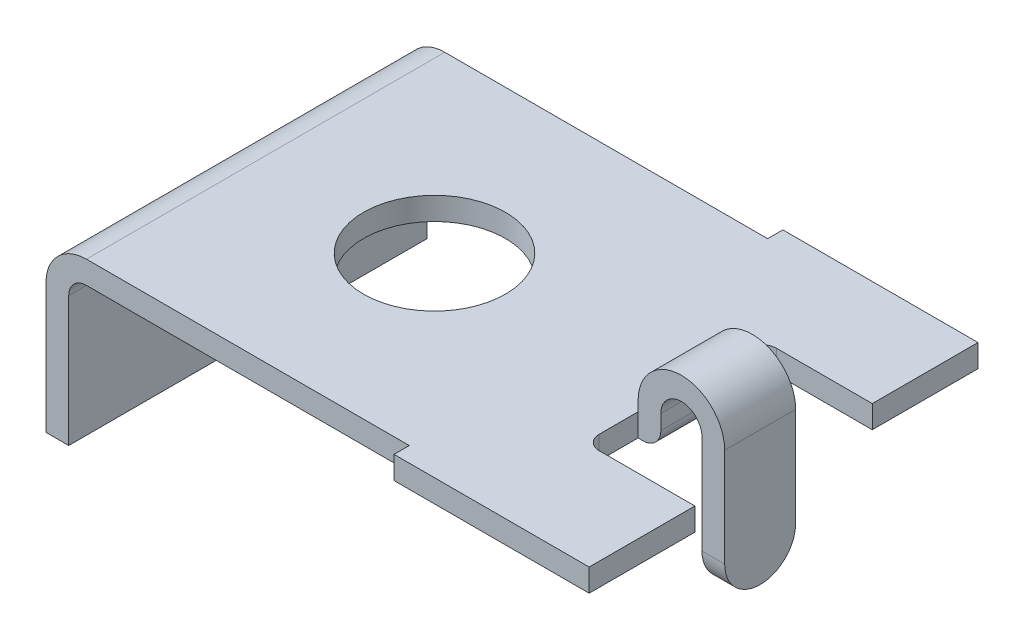
ISO-10303-21;
HEADER;
FILE_DESCRIPTION(('STEP AP214'),'2;1');
FILE_NAME('part.step','',(''),(''),'','','');
FILE_SCHEMA(('AUTOMOTIVE_DESIGN { 1 0 10303 214 1 1 1 1 }'));
ENDSEC;
DATA;
#1=APPLICATION_CONTEXT('core data for automotive mechanical design processes');
#2=APPLICATION_PROTOCOL_DEFINITION('international standard','automotive_design',2000,#1);
#3=PRODUCT_CONTEXT('',#1,'mechanical');
#4=PRODUCT('Part','Part','',(#3));
#5=PRODUCT_RELATED_PRODUCT_CATEGORY('part','',(#4));
#6=PRODUCT_DEFINITION_FORMATION('','',#4);
#7=PRODUCT_DEFINITION_CONTEXT('part definition',#1,'design');
#8=PRODUCT_DEFINITION('design','',#6,#7);
#9=PRODUCT_DEFINITION_SHAPE('','',#8);
#10=(LENGTH_UNIT() NAMED_UNIT(*) SI_UNIT(.MILLI.,.METRE.));
#11=(NAMED_UNIT(*) PLANE_ANGLE_UNIT() SI_UNIT($,.RADIAN.));
#12=(NAMED_UNIT(*) SI_UNIT($,.STERADIAN.) SOLID_ANGLE_UNIT());
#13=UNCERTAINTY_MEASURE_WITH_UNIT(LENGTH_MEASURE(1.E-05),#10,'distance_accuracy_value','');
#14=(GEOMETRIC_REPRESENTATION_CONTEXT(3) GLOBAL_UNCERTAINTY_ASSIGNED_CONTEXT((#13)) GLOBAL_UNIT_ASSIGNED_CONTEXT((#10,
#11,#12)) REPRESENTATION_CONTEXT('',''));
#15=CARTESIAN_POINT('',(0.,0.,0.));
#16=DIRECTION('',(0.,0.,1.));
#17=DIRECTION('',(1.,0.,0.));
#18=AXIS2_PLACEMENT_3D('',#15,#16,#17);
#19=CARTESIAN_POINT('',(18.3388,2.921,0.));
#20=DIRECTION('',(-1.,0.,0.));
#21=DIRECTION('',(0.,0.,1.));
#22=AXIS2_PLACEMENT_3D('',#19,#20,#21);
#23=CYLINDRICAL_SURFACE('',#22,1.27);
#24=DIRECTION('',(1.,0.,0.));
#25=VECTOR('',#24,1.);
#26=CARTESIAN_POINT('',(18.3388,2.921,1.27));
#27=LINE('',#26,#25);
#28=CARTESIAN_POINT('',(18.3388,2.921,1.27));
#29=VERTEX_POINT('',#28);
#30=CARTESIAN_POINT('',(19.1516,2.921,1.27));
#31=VERTEX_POINT('',#30);
#32=EDGE_CURVE('E252',#29,#31,#27,.T.);
#33=ORIENTED_EDGE('',*,*,#32,.F.);
#34=CARTESIAN_POINT('',(18.3388,2.921,0.));
#35=DIRECTION('',(1.,0.,0.));
#36=DIRECTION('',(0.,0.,-1.));
#37=AXIS2_PLACEMENT_3D('',#34,#35,#36);
#38=CIRCLE('',#37,1.27);
#39=CARTESIAN_POINT('',(18.3388,2.921,-1.27));
#40=VERTEX_POINT('',#39);
#41=EDGE_CURVE('E476',#40,#29,#38,.F.);
#42=ORIENTED_EDGE('',*,*,#41,.F.);
#43=DIRECTION('',(-1.,0.,0.));
#44=VECTOR('',#43,1.);
#45=CARTESIAN_POINT('',(17.6022,2.921,-1.27));
#46=LINE('',#45,#44);
#47=CARTESIAN_POINT('',(19.1516,2.921,-1.27));
#48=VERTEX_POINT('',#47);
#49=EDGE_CURVE('E472',#48,#40,#46,.T.);
#50=ORIENTED_EDGE('',*,*,#49,.F.);
#51=CARTESIAN_POINT('',(19.1516,2.921,0.));
#52=DIRECTION('',(1.,0.,0.));
#53=DIRECTION('',(0.,0.,-1.));
#54=AXIS2_PLACEMENT_3D('',#51,#52,#53);
#55=CIRCLE('',#54,1.27);
#56=EDGE_CURVE('E479',#31,#48,#55,.T.);
#57=ORIENTED_EDGE('',*,*,#56,.F.);
#58=EDGE_LOOP('',(#33,#42,#50,#57));
#59=FACE_BOUND('',#58,.T.);
#60=ADVANCED_FACE('F44',(#59),#23,.T.);
#61=CARTESIAN_POINT('',(16.0528,0.,3.175));
#62=DIRECTION('',(-1.,0.,0.));
#63=DIRECTION('',(0.,0.,1.));
#64=AXIS2_PLACEMENT_3D('',#61,#62,#63);
#65=PLANE('',#64);
#66=DIRECTION('',(0.,0.,1.));
#67=VECTOR('',#66,1.);
#68=CARTESIAN_POINT('',(16.0528,6.096,3.175));
#69=LINE('',#68,#67);
#70=CARTESIAN_POINT('',(16.0528,6.096,1.27));
#71=VERTEX_POINT('',#70);
#72=CARTESIAN_POINT('',(16.0528,6.096,2.667));
#73=VERTEX_POINT('',#72);
#74=EDGE_CURVE('E316',#71,#73,#69,.T.);
#75=ORIENTED_EDGE('',*,*,#74,.T.);
#76=DIRECTION('',(0.,1.,0.));
#77=VECTOR('',#76,1.);
#78=CARTESIAN_POINT('',(16.0528,5.2832,2.667));
#79=LINE('',#78,#77);
#80=CARTESIAN_POINT('',(16.0528,5.2832,2.667));
#81=VERTEX_POINT('',#80);
#82=EDGE_CURVE('E499',#73,#81,#79,.F.);
#83=ORIENTED_EDGE('',*,*,#82,.T.);
#84=DIRECTION('',(0.,0.,1.));
#85=VECTOR('',#84,1.);
#86=CARTESIAN_POINT('',(16.0528,5.2832,6.4135));
#87=LINE('',#86,#85);
#88=CARTESIAN_POINT('',(16.0528,5.2832,1.27));
#89=VERTEX_POINT('',#88);
#90=EDGE_CURVE('E334',#89,#81,#87,.T.);
#91=ORIENTED_EDGE('',*,*,#90,.F.);
#92=DIRECTION('',(0.,1.,0.));
#93=VECTOR('',#92,1.);
#94=CARTESIAN_POINT('',(16.0528,5.2832,1.27));
#95=LINE('',#94,#93);
#96=EDGE_CURVE('E264',#89,#71,#95,.T.);
#97=ORIENTED_EDGE('',*,*,#96,.T.);
#98=EDGE_LOOP('',(#75,#83,#91,#97));
#99=FACE_BOUND('',#98,.T.);
#100=ADVANCED_FACE('F600',(#99),#65,.F.);
#101=CARTESIAN_POINT('',(19.9898,6.096,6.4135));
#102=DIRECTION('',(1.,0.,0.));
#103=DIRECTION('',(0.,0.,-1.));
#104=AXIS2_PLACEMENT_3D('',#101,#102,#103);
#105=PLANE('',#104);
#106=DIRECTION('',(0.,1.,0.));
#107=VECTOR('',#106,1.);
#108=CARTESIAN_POINT('',(19.9898,0.,3.175));
#109=LINE('',#108,#107);
#110=CARTESIAN_POINT('',(19.9898,5.2832,3.175));
#111=VERTEX_POINT('',#110);
#112=CARTESIAN_POINT('',(19.9898,6.096,3.175));
#113=VERTEX_POINT('',#112);
#114=EDGE_CURVE('E325',#111,#113,#109,.T.);
#115=ORIENTED_EDGE('',*,*,#114,.T.);
#116=DIRECTION('',(0.,0.,-1.));
#117=VECTOR('',#116,1.);
#118=CARTESIAN_POINT('',(19.9898,6.096,6.4135));
#119=LINE('',#118,#117);
#120=CARTESIAN_POINT('',(19.9898,6.096,6.9596));
#121=VERTEX_POINT('',#120);
#122=EDGE_CURVE('E457',#121,#113,#119,.T.);
#123=ORIENTED_EDGE('',*,*,#122,.F.);
#124=DIRECTION('',(0.,1.,0.));
#125=VECTOR('',#124,1.);
#126=CARTESIAN_POINT('',(19.9898,6.096,6.9596));
#127=LINE('',#126,#125);
#128=CARTESIAN_POINT('',(19.9898,5.2832,6.9596));
#129=VERTEX_POINT('',#128);
#130=EDGE_CURVE('E342',#129,#121,#127,.T.);
#131=ORIENTED_EDGE('',*,*,#130,.F.);
#132=DIRECTION('',(0.,0.,-1.));
#133=VECTOR('',#132,1.);
#134=CARTESIAN_POINT('',(19.9898,5.2832,6.4135));
#135=LINE('',#134,#133);
#136=EDGE_CURVE('E462',#129,#111,#135,.T.);
#137=ORIENTED_EDGE('',*,*,#136,.T.);
#138=EDGE_LOOP('',(#115,#123,#131,#137));
#139=FACE_BOUND('',#138,.T.);
#140=ADVANCED_FACE('F618',(#139),#105,.T.);
#141=CARTESIAN_POINT('',(1.4478,4.6482,6.4135));
#142=DIRECTION('',(0.,0.,-1.));
#143=DIRECTION('',(-1.,0.,0.));
#144=AXIS2_PLACEMENT_3D('',#141,#142,#143);
#145=PLANE('',#144);
#146=DIRECTION('',(0.,-1.,0.));
#147=VECTOR('',#146,1.);
#148=CARTESIAN_POINT('',(13.0048,4.6482,6.4135));
#149=LINE('',#148,#147);
#150=CARTESIAN_POINT('',(13.0048,6.096,6.4135));
#151=VERTEX_POINT('',#150);
#152=CARTESIAN_POINT('',(13.0048,5.2832,6.4135));
#153=VERTEX_POINT('',#152);
#154=EDGE_CURVE('E381',#151,#153,#149,.T.);
#155=ORIENTED_EDGE('',*,*,#154,.F.);
#156=DIRECTION('',(1.,0.,0.));
#157=VECTOR('',#156,1.);
#158=CARTESIAN_POINT('',(1.4478,6.096,6.4135));
#159=LINE('',#158,#157);
#160=CARTESIAN_POINT('',(1.4478,6.096,6.4135));
#161=VERTEX_POINT('',#160);
#162=EDGE_CURVE('E389',#161,#151,#159,.T.);
#163=ORIENTED_EDGE('',*,*,#162,.F.);
#164=CARTESIAN_POINT('',(1.4478,4.6482,6.4135));
#165=DIRECTION('',(0.,0.,-1.));
#166=DIRECTION('',(-1.,0.,0.));
#167=AXIS2_PLACEMENT_3D('',#164,#165,#166);
#168=CIRCLE('',#167,1.4478);
#169=CARTESIAN_POINT('',(0.,4.6482,6.4135));
#170=VERTEX_POINT('',#169);
#171=EDGE_CURVE('E394',#170,#161,#168,.T.);
#172=ORIENTED_EDGE('',*,*,#171,.F.);
#173=DIRECTION('',(0.,1.,0.));
#174=VECTOR('',#173,1.);
#175=CARTESIAN_POINT('',(0.,0.,6.4135));
#176=LINE('',#175,#174);
#177=CARTESIAN_POINT('',(0.,0.,6.4135));
#178=VERTEX_POINT('',#177);
#179=EDGE_CURVE('E398',#178,#170,#176,.T.);
#180=ORIENTED_EDGE('',*,*,#179,.F.);
#181=DIRECTION('',(-1.,0.,0.));
#182=VECTOR('',#181,1.);
#183=CARTESIAN_POINT('',(0.8128,0.,6.4135));
#184=LINE('',#183,#182);
#185=CARTESIAN_POINT('',(0.8128,0.,6.4135));
#186=VERTEX_POINT('',#185);
#187=EDGE_CURVE('E402',#186,#178,#184,.T.);
#188=ORIENTED_EDGE('',*,*,#187,.F.);
#189=DIRECTION('',(0.,1.,0.));
#190=VECTOR('',#189,1.);
#191=CARTESIAN_POINT('',(0.8128,0.,6.4135));
#192=LINE('',#191,#190);
#193=CARTESIAN_POINT('',(0.8128,4.6482,6.4135));
#194=VERTEX_POINT('',#193);
#195=EDGE_CURVE('E406',#186,#194,#192,.T.);
#196=ORIENTED_EDGE('',*,*,#195,.T.);
#197=CARTESIAN_POINT('',(1.4478,4.6482,6.4135));
#198=DIRECTION('',(0.,0.,1.));
#199=DIRECTION('',(1.,0.,0.));
#200=AXIS2_PLACEMENT_3D('',#197,#198,#199);
#201=CIRCLE('',#200,0.635);
#202=CARTESIAN_POINT('',(1.4478,5.2832,6.4135));
#203=VERTEX_POINT('',#202);
#204=EDGE_CURVE('E409',#194,#203,#201,.F.);
#205=ORIENTED_EDGE('',*,*,#204,.T.);
#206=DIRECTION('',(1.,0.,0.));
#207=VECTOR('',#206,1.);
#208=CARTESIAN_POINT('',(1.4478,5.2832,6.4135));
#209=LINE('',#208,#207);
#210=EDGE_CURVE('E386',#203,#153,#209,.T.);
#211=ORIENTED_EDGE('',*,*,#210,.T.);
#212=EDGE_LOOP('',(#155,#163,#172,#180,#188,#196,#205,#211));
#213=FACE_BOUND('',#212,.T.);
#214=ADVANCED_FACE('F632',(#213),#145,.F.);
#215=CARTESIAN_POINT('',(1.4478,4.6482,-6.4135));
#216=DIRECTION('',(0.,0.,-1.));
#217=DIRECTION('',(-1.,0.,0.));
#218=AXIS2_PLACEMENT_3D('',#215,#216,#217);
#219=PLANE('',#218);
#220=DIRECTION('',(1.,0.,0.));
#221=VECTOR('',#220,1.);
#222=CARTESIAN_POINT('',(1.4478,6.096,-6.4135));
#223=LINE('',#222,#221);
#224=CARTESIAN_POINT('',(1.4478,6.096,-6.4135));
#225=VERTEX_POINT('',#224);
#226=CARTESIAN_POINT('',(13.0048,6.096,-6.4135));
#227=VERTEX_POINT('',#226);
#228=EDGE_CURVE('E416',#225,#227,#223,.T.);
#229=ORIENTED_EDGE('',*,*,#228,.T.);
#230=DIRECTION('',(0.,-1.,0.));
#231=VECTOR('',#230,1.);
#232=CARTESIAN_POINT('',(13.0048,4.6482,-6.4135));
#233=LINE('',#232,#231);
#234=CARTESIAN_POINT('',(13.0048,5.2832,-6.4135));
#235=VERTEX_POINT('',#234);
#236=EDGE_CURVE('E466',#227,#235,#233,.T.);
#237=ORIENTED_EDGE('',*,*,#236,.T.);
#238=DIRECTION('',(1.,0.,0.));
#239=VECTOR('',#238,1.);
#240=CARTESIAN_POINT('',(1.4478,5.2832,-6.4135));
#241=LINE('',#240,#239);
#242=CARTESIAN_POINT('',(1.4478,5.2832,-6.4135));
#243=VERTEX_POINT('',#242);
#244=EDGE_CURVE('E385',#243,#235,#241,.T.);
#245=ORIENTED_EDGE('',*,*,#244,.F.);
#246=CARTESIAN_POINT('',(1.4478,4.6482,-6.4135));
#247=DIRECTION('',(0.,0.,1.));
#248=DIRECTION('',(1.,0.,0.));
#249=AXIS2_PLACEMENT_3D('',#246,#247,#248);
#250=CIRCLE('',#249,0.635);
#251=CARTESIAN_POINT('',(0.8128,4.6482,-6.4135));
#252=VERTEX_POINT('',#251);
#253=EDGE_CURVE('E390',#252,#243,#250,.F.);
#254=ORIENTED_EDGE('',*,*,#253,.F.);
#255=DIRECTION('',(0.,1.,0.));
#256=VECTOR('',#255,1.);
#257=CARTESIAN_POINT('',(0.8128,0.,-6.4135));
#258=LINE('',#257,#256);
#259=CARTESIAN_POINT('',(0.8128,0.,-6.4135));
#260=VERTEX_POINT('',#259);
#261=EDGE_CURVE('E432',#260,#252,#258,.T.);
#262=ORIENTED_EDGE('',*,*,#261,.F.);
#263=DIRECTION('',(-1.,0.,0.));
#264=VECTOR('',#263,1.);
#265=CARTESIAN_POINT('',(0.8128,0.,-6.4135));
#266=LINE('',#265,#264);
#267=CARTESIAN_POINT('',(0.,0.,-6.4135));
#268=VERTEX_POINT('',#267);
#269=EDGE_CURVE('E428',#260,#268,#266,.T.);
#270=ORIENTED_EDGE('',*,*,#269,.T.);
#271=DIRECTION('',(0.,1.,0.));
#272=VECTOR('',#271,1.);
#273=CARTESIAN_POINT('',(0.,0.,-6.4135));
#274=LINE('',#273,#272);
#275=CARTESIAN_POINT('',(0.,4.6482,-6.4135));
#276=VERTEX_POINT('',#275);
#277=EDGE_CURVE('E424',#268,#276,#274,.T.);
#278=ORIENTED_EDGE('',*,*,#277,.T.);
#279=CARTESIAN_POINT('',(1.4478,4.6482,-6.4135));
#280=DIRECTION('',(0.,0.,-1.));
#281=DIRECTION('',(-1.,0.,0.));
#282=AXIS2_PLACEMENT_3D('',#279,#280,#281);
#283=CIRCLE('',#282,1.4478);
#284=EDGE_CURVE('E420',#276,#225,#283,.T.);
#285=ORIENTED_EDGE('',*,*,#284,.T.);
#286=EDGE_LOOP('',(#229,#237,#245,#254,#262,#270,#278,#285));
#287=FACE_BOUND('',#286,.T.);
#288=ADVANCED_FACE('F643',(#287),#219,.T.);
#289=CARTESIAN_POINT('',(1.4478,5.2832,6.4135));
#290=DIRECTION('',(0.,1.,0.));
#291=DIRECTION('',(0.,0.,1.));
#292=AXIS2_PLACEMENT_3D('',#289,#290,#291);
#293=PLANE('',#292);
#294=CARTESIAN_POINT('',(7.493,5.2832,0.));
#295=DIRECTION('',(0.,1.,0.));
#296=DIRECTION('',(0.,0.,1.));
#297=AXIS2_PLACEMENT_3D('',#294,#295,#296);
#298=CIRCLE('',#297,2.54);
#299=CARTESIAN_POINT('',(7.493,5.2832,2.54));
#300=VERTEX_POINT('',#299);
#301=EDGE_CURVE('E284',#300,#300,#298,.T.);
#302=ORIENTED_EDGE('',*,*,#301,.T.);
#303=EDGE_LOOP('',(#302));
#304=FACE_BOUND('',#303,.T.);
#305=DIRECTION('',(-1.,0.,0.));
#306=VECTOR('',#305,1.);
#307=CARTESIAN_POINT('',(16.8656,5.2832,-1.27));
#308=LINE('',#307,#306);
#309=CARTESIAN_POINT('',(16.2306,5.2832,-1.27));
#310=VERTEX_POINT('',#309);
#311=CARTESIAN_POINT('',(16.0528,5.2832,-1.27));
#312=VERTEX_POINT('',#311);
#313=EDGE_CURVE('E295',#310,#312,#308,.T.);
#314=ORIENTED_EDGE('',*,*,#313,.F.);
#315=DIRECTION('',(0.,0.,-1.));
#316=VECTOR('',#315,1.);
#317=CARTESIAN_POINT('',(16.2306,5.2832,6.4135));
#318=LINE('',#317,#316);
#319=CARTESIAN_POINT('',(16.2306,5.2832,1.27));
#320=VERTEX_POINT('',#319);
#321=EDGE_CURVE('E489',#310,#320,#318,.F.);
#322=ORIENTED_EDGE('',*,*,#321,.T.);
#323=DIRECTION('',(-1.,0.,0.));
#324=VECTOR('',#323,1.);
#325=CARTESIAN_POINT('',(16.8656,5.2832,1.27));
#326=LINE('',#325,#324);
#327=EDGE_CURVE('E270',#320,#89,#326,.T.);
#328=ORIENTED_EDGE('',*,*,#327,.T.);
#329=ORIENTED_EDGE('',*,*,#90,.T.);
#330=CARTESIAN_POINT('',(16.5608,5.2832,2.667));
#331=DIRECTION('',(0.,1.,0.));
#332=DIRECTION('',(0.,0.,1.));
#333=AXIS2_PLACEMENT_3D('',#330,#331,#332);
#334=CIRCLE('',#333,0.508);
#335=CARTESIAN_POINT('',(16.5608,5.2832,3.175));
#336=VERTEX_POINT('',#335);
#337=EDGE_CURVE('E511',#81,#336,#334,.T.);
#338=ORIENTED_EDGE('',*,*,#337,.T.);
#339=DIRECTION('',(1.,0.,0.));
#340=VECTOR('',#339,1.);
#341=CARTESIAN_POINT('',(1.4478,5.2832,3.175));
#342=LINE('',#341,#340);
#343=EDGE_CURVE('E338',#336,#111,#342,.T.);
#344=ORIENTED_EDGE('',*,*,#343,.T.);
#345=ORIENTED_EDGE('',*,*,#136,.F.);
#346=DIRECTION('',(1.,0.,0.));
#347=VECTOR('',#346,1.);
#348=CARTESIAN_POINT('',(19.9898,5.2832,6.9596));
#349=LINE('',#348,#347);
#350=CARTESIAN_POINT('',(13.0048,5.2832,6.9596));
#351=VERTEX_POINT('',#350);
#352=EDGE_CURVE('E353',#351,#129,#349,.T.);
#353=ORIENTED_EDGE('',*,*,#352,.F.);
#354=DIRECTION('',(0.,0.,-1.));
#355=VECTOR('',#354,1.);
#356=CARTESIAN_POINT('',(13.0048,5.2832,6.9596));
#357=LINE('',#356,#355);
#358=EDGE_CURVE('E372',#351,#153,#357,.T.);
#359=ORIENTED_EDGE('',*,*,#358,.T.);
#360=ORIENTED_EDGE('',*,*,#210,.F.);
#361=DIRECTION('',(0.,0.,-1.));
#362=VECTOR('',#361,1.);
#363=CARTESIAN_POINT('',(1.4478,5.2832,6.4135));
#364=LINE('',#363,#362);
#365=EDGE_CURVE('E412',#203,#243,#364,.T.);
#366=ORIENTED_EDGE('',*,*,#365,.T.);
#367=ORIENTED_EDGE('',*,*,#244,.T.);
#368=CARTESIAN_POINT('',(13.0048,5.2832,-6.9596));
#369=VERTEX_POINT('',#368);
#370=EDGE_CURVE('E357',#235,#369,#357,.T.);
#371=ORIENTED_EDGE('',*,*,#370,.T.);
#372=DIRECTION('',(1.,0.,0.));
#373=VECTOR('',#372,1.);
#374=CARTESIAN_POINT('',(19.9898,5.2832,-6.9596));
#375=LINE('',#374,#373);
#376=CARTESIAN_POINT('',(19.9898,5.2832,-6.9596));
#377=VERTEX_POINT('',#376);
#378=EDGE_CURVE('E347',#369,#377,#375,.T.);
#379=ORIENTED_EDGE('',*,*,#378,.T.);
#380=CARTESIAN_POINT('',(19.9898,5.2832,-3.175));
#381=VERTEX_POINT('',#380);
#382=EDGE_CURVE('E461',#381,#377,#135,.T.);
#383=ORIENTED_EDGE('',*,*,#382,.F.);
#384=DIRECTION('',(-1.,0.,0.));
#385=VECTOR('',#384,1.);
#386=CARTESIAN_POINT('',(1.4478,5.2832,-3.17499999999999));
#387=LINE('',#386,#385);
#388=CARTESIAN_POINT('',(16.5608,5.2832,-3.175));
#389=VERTEX_POINT('',#388);
#390=EDGE_CURVE('E329',#381,#389,#387,.T.);
#391=ORIENTED_EDGE('',*,*,#390,.T.);
#392=CARTESIAN_POINT('',(16.5608,5.2832,-2.667));
#393=DIRECTION('',(0.,1.,0.));
#394=DIRECTION('',(0.,0.,1.));
#395=AXIS2_PLACEMENT_3D('',#392,#393,#394);
#396=CIRCLE('',#395,0.508);
#397=CARTESIAN_POINT('',(16.0528,5.2832,-2.667));
#398=VERTEX_POINT('',#397);
#399=EDGE_CURVE('E11',#389,#398,#396,.T.);
#400=ORIENTED_EDGE('',*,*,#399,.T.);
#401=EDGE_CURVE('E335',#398,#312,#87,.T.);
#402=ORIENTED_EDGE('',*,*,#401,.T.);
#403=EDGE_LOOP('',(#314,#322,#328,#329,#338,#344,#345,#353,#359,#360,#366,#367,#371,#379,#383,
#391,#400,#402));
#404=FACE_BOUND('',#403,.T.);
#405=ADVANCED_FACE('F611',(#304,#404),#293,.F.);
#406=DIRECTION('',(0.,1.,0.));
#407=VECTOR('',#406,1.);
#408=CARTESIAN_POINT('',(19.9898,0.,-3.175));
#409=LINE('',#408,#407);
#410=CARTESIAN_POINT('',(19.9898,6.096,-3.175));
#411=VERTEX_POINT('',#410);
#412=EDGE_CURVE('E324',#381,#411,#409,.T.);
#413=ORIENTED_EDGE('',*,*,#412,.F.);
#414=ORIENTED_EDGE('',*,*,#382,.T.);
#415=DIRECTION('',(0.,1.,0.));
#416=VECTOR('',#415,1.);
#417=CARTESIAN_POINT('',(19.9898,6.096,-6.9596));
#418=LINE('',#417,#416);
#419=CARTESIAN_POINT('',(19.9898,6.096,-6.9596));
#420=VERTEX_POINT('',#419);
#421=EDGE_CURVE('E341',#377,#420,#418,.T.);
#422=ORIENTED_EDGE('',*,*,#421,.T.);
#423=EDGE_CURVE('E456',#411,#420,#119,.T.);
#424=ORIENTED_EDGE('',*,*,#423,.F.);
#425=EDGE_LOOP('',(#413,#414,#422,#424));
#426=FACE_BOUND('',#425,.T.);
#427=ADVANCED_FACE('F658',(#426),#105,.T.);
#428=CARTESIAN_POINT('',(1.4478,6.096,6.4135));
#429=DIRECTION('',(0.,1.,0.));
#430=DIRECTION('',(0.,0.,1.));
#431=AXIS2_PLACEMENT_3D('',#428,#429,#430);
#432=PLANE('',#431);
#433=CARTESIAN_POINT('',(7.493,6.096,0.));
#434=DIRECTION('',(0.,1.,0.));
#435=DIRECTION('',(0.,0.,1.));
#436=AXIS2_PLACEMENT_3D('',#433,#434,#435);
#437=CIRCLE('',#436,2.54);
#438=CARTESIAN_POINT('',(7.493,6.096,2.54));
#439=VERTEX_POINT('',#438);
#440=EDGE_CURVE('E697',#439,#439,#437,.T.);
#441=ORIENTED_EDGE('',*,*,#440,.F.);
#442=EDGE_LOOP('',(#441));
#443=FACE_BOUND('',#442,.T.);
#444=DIRECTION('',(1.,0.,0.));
#445=VECTOR('',#444,1.);
#446=CARTESIAN_POINT('',(19.9898,6.096,3.175));
#447=LINE('',#446,#445);
#448=CARTESIAN_POINT('',(16.5608,6.096,3.175));
#449=VERTEX_POINT('',#448);
#450=EDGE_CURVE('E320',#449,#113,#447,.T.);
#451=ORIENTED_EDGE('',*,*,#450,.F.);
#452=CARTESIAN_POINT('',(16.5608,6.096,2.667));
#453=DIRECTION('',(0.,1.,0.));
#454=DIRECTION('',(0.,0.,1.));
#455=AXIS2_PLACEMENT_3D('',#452,#453,#454);
#456=CIRCLE('',#455,0.508);
#457=EDGE_CURVE('E508',#449,#73,#456,.F.);
#458=ORIENTED_EDGE('',*,*,#457,.T.);
#459=ORIENTED_EDGE('',*,*,#74,.F.);
#460=CARTESIAN_POINT('',(16.0528,6.096,-1.27));
#461=VERTEX_POINT('',#460);
#462=EDGE_CURVE('E321',#461,#71,#69,.T.);
#463=ORIENTED_EDGE('',*,*,#462,.F.);
#464=CARTESIAN_POINT('',(16.0528,6.096,-2.667));
#465=VERTEX_POINT('',#464);
#466=EDGE_CURVE('E317',#465,#461,#69,.T.);
#467=ORIENTED_EDGE('',*,*,#466,.F.);
#468=CARTESIAN_POINT('',(16.5608,6.096,-2.667));
#469=DIRECTION('',(0.,1.,0.));
#470=DIRECTION('',(0.,0.,1.));
#471=AXIS2_PLACEMENT_3D('',#468,#469,#470);
#472=CIRCLE('',#471,0.508);
#473=CARTESIAN_POINT('',(16.5608,6.096,-3.175));
#474=VERTEX_POINT('',#473);
#475=EDGE_CURVE('E53',#465,#474,#472,.F.);
#476=ORIENTED_EDGE('',*,*,#475,.T.);
#477=DIRECTION('',(-1.,0.,0.));
#478=VECTOR('',#477,1.);
#479=CARTESIAN_POINT('',(19.9898,6.096,-3.175));
#480=LINE('',#479,#478);
#481=EDGE_CURVE('E240',#411,#474,#480,.T.);
#482=ORIENTED_EDGE('',*,*,#481,.F.);
#483=ORIENTED_EDGE('',*,*,#423,.T.);
#484=DIRECTION('',(-1.,0.,0.));
#485=VECTOR('',#484,1.);
#486=CARTESIAN_POINT('',(19.9898,6.096,-6.9596));
#487=LINE('',#486,#485);
#488=CARTESIAN_POINT('',(13.0048,6.096,-6.9596));
#489=VERTEX_POINT('',#488);
#490=EDGE_CURVE('E361',#420,#489,#487,.T.);
#491=ORIENTED_EDGE('',*,*,#490,.T.);
#492=DIRECTION('',(0.,0.,-1.));
#493=VECTOR('',#492,1.);
#494=CARTESIAN_POINT('',(13.0048,6.096,6.9596));
#495=LINE('',#494,#493);
#496=EDGE_CURVE('E376',#227,#489,#495,.T.);
#497=ORIENTED_EDGE('',*,*,#496,.F.);
#498=ORIENTED_EDGE('',*,*,#228,.F.);
#499=DIRECTION('',(0.,0.,-1.));
#500=VECTOR('',#499,1.);
#501=CARTESIAN_POINT('',(1.4478,6.096,6.4135));
#502=LINE('',#501,#500);
#503=EDGE_CURVE('E453',#161,#225,#502,.T.);
#504=ORIENTED_EDGE('',*,*,#503,.F.);
#505=ORIENTED_EDGE('',*,*,#162,.T.);
#506=CARTESIAN_POINT('',(13.0048,6.096,6.9596));
#507=VERTEX_POINT('',#506);
#508=EDGE_CURVE('E377',#507,#151,#495,.T.);
#509=ORIENTED_EDGE('',*,*,#508,.F.);
#510=DIRECTION('',(-1.,0.,0.));
#511=VECTOR('',#510,1.);
#512=CARTESIAN_POINT('',(19.9898,6.096,6.9596));
#513=LINE('',#512,#511);
#514=EDGE_CURVE('E346',#121,#507,#513,.T.);
#515=ORIENTED_EDGE('',*,*,#514,.F.);
#516=ORIENTED_EDGE('',*,*,#122,.T.);
#517=EDGE_LOOP('',(#451,#458,#459,#463,#467,#476,#482,#483,#491,#497,#498,#504,#505,#509,#515,#516));
#518=FACE_BOUND('',#517,.T.);
#519=ADVANCED_FACE('F667',(#443,#518),#432,.T.);
#520=CARTESIAN_POINT('',(1.4478,4.6482,6.4135));
#521=DIRECTION('',(0.,0.,-1.));
#522=DIRECTION('',(-1.,0.,0.));
#523=AXIS2_PLACEMENT_3D('',#520,#521,#522);
#524=CYLINDRICAL_SURFACE('',#523,1.4478);
#525=ORIENTED_EDGE('',*,*,#284,.F.);
#526=DIRECTION('',(0.,0.,-1.));
#527=VECTOR('',#526,1.);
#528=CARTESIAN_POINT('',(0.,4.6482,6.4135));
#529=LINE('',#528,#527);
#530=EDGE_CURVE('E450',#170,#276,#529,.T.);
#531=ORIENTED_EDGE('',*,*,#530,.F.);
#532=ORIENTED_EDGE('',*,*,#171,.T.);
#533=ORIENTED_EDGE('',*,*,#503,.T.);
#534=EDGE_LOOP('',(#525,#531,#532,#533));
#535=FACE_BOUND('',#534,.T.);
#536=ADVANCED_FACE('F707',(#535),#524,.T.);
#537=CARTESIAN_POINT('',(0.,0.,6.4135));
#538=DIRECTION('',(-1.,0.,0.));
#539=DIRECTION('',(0.,0.,1.));
#540=AXIS2_PLACEMENT_3D('',#537,#538,#539);
#541=PLANE('',#540);
#542=ORIENTED_EDGE('',*,*,#277,.F.);
#543=DIRECTION('',(0.,0.,-1.));
#544=VECTOR('',#543,1.);
#545=CARTESIAN_POINT('',(0.,0.,6.4135));
#546=LINE('',#545,#544);
#547=EDGE_CURVE('E447',#178,#268,#546,.T.);
#548=ORIENTED_EDGE('',*,*,#547,.F.);
#549=ORIENTED_EDGE('',*,*,#179,.T.);
#550=ORIENTED_EDGE('',*,*,#530,.T.);
#551=EDGE_LOOP('',(#542,#548,#549,#550));
#552=FACE_BOUND('',#551,.T.);
#553=ADVANCED_FACE('F713',(#552),#541,.T.);
#554=CARTESIAN_POINT('',(0.8128,0.,6.4135));
#555=DIRECTION('',(0.,-1.,0.));
#556=DIRECTION('',(0.,0.,-1.));
#557=AXIS2_PLACEMENT_3D('',#554,#555,#556);
#558=PLANE('',#557);
#559=ORIENTED_EDGE('',*,*,#269,.F.);
#560=DIRECTION('',(0.,0.,-1.));
#561=VECTOR('',#560,1.);
#562=CARTESIAN_POINT('',(0.8128,0.,6.4135));
#563=LINE('',#562,#561);
#564=EDGE_CURVE('E444',#186,#260,#563,.T.);
#565=ORIENTED_EDGE('',*,*,#564,.F.);
#566=ORIENTED_EDGE('',*,*,#187,.T.);
#567=ORIENTED_EDGE('',*,*,#547,.T.);
#568=EDGE_LOOP('',(#559,#565,#566,#567));
#569=FACE_BOUND('',#568,.T.);
#570=ADVANCED_FACE('F776',(#569),#558,.T.);
#571=CARTESIAN_POINT('',(0.8128,0.,6.4135));
#572=DIRECTION('',(-1.,0.,0.));
#573=DIRECTION('',(0.,0.,1.));
#574=AXIS2_PLACEMENT_3D('',#571,#572,#573);
#575=PLANE('',#574);
#576=ORIENTED_EDGE('',*,*,#261,.T.);
#577=DIRECTION('',(0.,0.,-1.));
#578=VECTOR('',#577,1.);
#579=CARTESIAN_POINT('',(0.8128,4.6482,6.4135));
#580=LINE('',#579,#578);
#581=EDGE_CURVE('E440',#194,#252,#580,.T.);
#582=ORIENTED_EDGE('',*,*,#581,.F.);
#583=ORIENTED_EDGE('',*,*,#195,.F.);
#584=ORIENTED_EDGE('',*,*,#564,.T.);
#585=EDGE_LOOP('',(#576,#582,#583,#584));
#586=FACE_BOUND('',#585,.T.);
#587=ADVANCED_FACE('F773',(#586),#575,.F.);
#588=CARTESIAN_POINT('',(1.4478,4.6482,6.4135));
#589=DIRECTION('',(0.,0.,-1.));
#590=DIRECTION('',(-1.,0.,0.));
#591=AXIS2_PLACEMENT_3D('',#588,#589,#590);
#592=CYLINDRICAL_SURFACE('',#591,0.635);
#593=ORIENTED_EDGE('',*,*,#253,.T.);
#594=ORIENTED_EDGE('',*,*,#365,.F.);
#595=ORIENTED_EDGE('',*,*,#204,.F.);
#596=ORIENTED_EDGE('',*,*,#581,.T.);
#597=EDGE_LOOP('',(#593,#594,#595,#596));
#598=FACE_BOUND('',#597,.T.);
#599=ADVANCED_FACE('F639',(#598),#592,.F.);
#600=CARTESIAN_POINT('',(0.,0.,-6.9596));
#601=DIRECTION('',(0.,0.,-1.));
#602=DIRECTION('',(-1.,0.,0.));
#603=AXIS2_PLACEMENT_3D('',#600,#601,#602);
#604=PLANE('',#603);
#605=ORIENTED_EDGE('',*,*,#421,.F.);
#606=ORIENTED_EDGE('',*,*,#378,.F.);
#607=DIRECTION('',(0.,-1.,0.));
#608=VECTOR('',#607,1.);
#609=CARTESIAN_POINT('',(13.0048,6.096,-6.9596));
#610=LINE('',#609,#608);
#611=EDGE_CURVE('E365',#489,#369,#610,.T.);
#612=ORIENTED_EDGE('',*,*,#611,.F.);
#613=ORIENTED_EDGE('',*,*,#490,.F.);
#614=EDGE_LOOP('',(#605,#606,#612,#613));
#615=FACE_BOUND('',#614,.T.);
#616=ADVANCED_FACE('F654',(#615),#604,.T.);
#617=CARTESIAN_POINT('',(13.0048,6.096,6.9596));
#618=DIRECTION('',(1.,0.,0.));
#619=DIRECTION('',(0.,0.,-1.));
#620=AXIS2_PLACEMENT_3D('',#617,#618,#619);
#621=PLANE('',#620);
#622=ORIENTED_EDGE('',*,*,#236,.F.);
#623=ORIENTED_EDGE('',*,*,#496,.T.);
#624=ORIENTED_EDGE('',*,*,#611,.T.);
#625=ORIENTED_EDGE('',*,*,#370,.F.);
#626=EDGE_LOOP('',(#622,#623,#624,#625));
#627=FACE_BOUND('',#626,.T.);
#628=ADVANCED_FACE('F650',(#627),#621,.F.);
#629=ORIENTED_EDGE('',*,*,#508,.T.);
#630=ORIENTED_EDGE('',*,*,#154,.T.);
#631=ORIENTED_EDGE('',*,*,#358,.F.);
#632=DIRECTION('',(0.,-1.,0.));
#633=VECTOR('',#632,1.);
#634=CARTESIAN_POINT('',(13.0048,6.096,6.9596));
#635=LINE('',#634,#633);
#636=EDGE_CURVE('E350',#507,#351,#635,.T.);
#637=ORIENTED_EDGE('',*,*,#636,.F.);
#638=EDGE_LOOP('',(#629,#630,#631,#637));
#639=FACE_BOUND('',#638,.T.);
#640=ADVANCED_FACE('F627',(#639),#621,.F.);
#641=CARTESIAN_POINT('',(0.,0.,6.9596));
#642=DIRECTION('',(0.,0.,-1.));
#643=DIRECTION('',(-1.,0.,0.));
#644=AXIS2_PLACEMENT_3D('',#641,#642,#643);
#645=PLANE('',#644);
#646=ORIENTED_EDGE('',*,*,#130,.T.);
#647=ORIENTED_EDGE('',*,*,#514,.T.);
#648=ORIENTED_EDGE('',*,*,#636,.T.);
#649=ORIENTED_EDGE('',*,*,#352,.T.);
#650=EDGE_LOOP('',(#646,#647,#648,#649));
#651=FACE_BOUND('',#650,.T.);
#652=ADVANCED_FACE('F621',(#651),#645,.F.);
#653=CARTESIAN_POINT('',(19.9898,0.,3.175));
#654=DIRECTION('',(0.,0.,1.));
#655=DIRECTION('',(1.,0.,0.));
#656=AXIS2_PLACEMENT_3D('',#653,#654,#655);
#657=PLANE('',#656);
#658=ORIENTED_EDGE('',*,*,#343,.F.);
#659=DIRECTION('',(0.,1.,0.));
#660=VECTOR('',#659,1.);
#661=CARTESIAN_POINT('',(16.5608,6.096,3.175));
#662=LINE('',#661,#660);
#663=EDGE_CURVE('E495',#336,#449,#662,.T.);
#664=ORIENTED_EDGE('',*,*,#663,.T.);
#665=ORIENTED_EDGE('',*,*,#450,.T.);
#666=ORIENTED_EDGE('',*,*,#114,.F.);
#667=EDGE_LOOP('',(#658,#664,#665,#666));
#668=FACE_BOUND('',#667,.T.);
#669=ADVANCED_FACE('F614',(#668),#657,.F.);
#670=ORIENTED_EDGE('',*,*,#401,.F.);
#671=DIRECTION('',(0.,1.,0.));
#672=VECTOR('',#671,1.);
#673=CARTESIAN_POINT('',(16.0528,6.096,-2.667));
#674=LINE('',#673,#672);
#675=EDGE_CURVE('E502',#398,#465,#674,.T.);
#676=ORIENTED_EDGE('',*,*,#675,.T.);
#677=ORIENTED_EDGE('',*,*,#466,.T.);
#678=DIRECTION('',(0.,1.,0.));
#679=VECTOR('',#678,1.);
#680=CARTESIAN_POINT('',(16.0528,5.2832,-1.27));
#681=LINE('',#680,#679);
#682=EDGE_CURVE('E291',#312,#461,#681,.T.);
#683=ORIENTED_EDGE('',*,*,#682,.F.);
#684=EDGE_LOOP('',(#670,#676,#677,#683));
#685=FACE_BOUND('',#684,.T.);
#686=ADVANCED_FACE('F664',(#685),#65,.F.);
#687=CARTESIAN_POINT('',(19.9898,0.,-3.175));
#688=DIRECTION('',(0.,0.,-1.));
#689=DIRECTION('',(-1.,0.,0.));
#690=AXIS2_PLACEMENT_3D('',#687,#688,#689);
#691=PLANE('',#690);
#692=ORIENTED_EDGE('',*,*,#481,.T.);
#693=DIRECTION('',(0.,1.,0.));
#694=VECTOR('',#693,1.);
#695=CARTESIAN_POINT('',(16.5608,5.2832,-3.175));
#696=LINE('',#695,#694);
#697=EDGE_CURVE('E60',#474,#389,#696,.F.);
#698=ORIENTED_EDGE('',*,*,#697,.T.);
#699=ORIENTED_EDGE('',*,*,#390,.F.);
#700=ORIENTED_EDGE('',*,*,#412,.T.);
#701=EDGE_LOOP('',(#692,#698,#699,#700));
#702=FACE_BOUND('',#701,.T.);
#703=ADVANCED_FACE('F755',(#702),#691,.F.);
#704=CARTESIAN_POINT('',(18.3388,6.4516,1.27));
#705=DIRECTION('',(1.,0.,0.));
#706=DIRECTION('',(0.,0.,-1.));
#707=AXIS2_PLACEMENT_3D('',#704,#705,#706);
#708=PLANE('',#707);
#709=DIRECTION('',(0.,1.,0.));
#710=VECTOR('',#709,1.);
#711=CARTESIAN_POINT('',(18.3388,6.4516,-1.27));
#712=LINE('',#711,#710);
#713=CARTESIAN_POINT('',(18.3388,6.4516,-1.27));
#714=VERTEX_POINT('',#713);
#715=EDGE_CURVE('E280',#714,#40,#712,.F.);
#716=ORIENTED_EDGE('',*,*,#715,.T.);
#717=ORIENTED_EDGE('',*,*,#41,.T.);
#718=DIRECTION('',(0.,1.,0.));
#719=VECTOR('',#718,1.);
#720=CARTESIAN_POINT('',(18.3388,6.4516,1.27));
#721=LINE('',#720,#719);
#722=CARTESIAN_POINT('',(18.3388,6.4516,1.27));
#723=VERTEX_POINT('',#722);
#724=EDGE_CURVE('E254',#723,#29,#721,.F.);
#725=ORIENTED_EDGE('',*,*,#724,.F.);
#726=DIRECTION('',(0.,0.,-1.));
#727=VECTOR('',#726,1.);
#728=CARTESIAN_POINT('',(18.3388,6.4516,1.27));
#729=LINE('',#728,#727);
#730=EDGE_CURVE('E279',#723,#714,#729,.T.);
#731=ORIENTED_EDGE('',*,*,#730,.T.);
#732=EDGE_LOOP('',(#716,#717,#725,#731));
#733=FACE_BOUND('',#732,.T.);
#734=ADVANCED_FACE('F690',(#733),#708,.F.);
#735=CARTESIAN_POINT('',(19.1516,6.4516,1.27));
#736=DIRECTION('',(1.,0.,0.));
#737=DIRECTION('',(0.,0.,-1.));
#738=AXIS2_PLACEMENT_3D('',#735,#736,#737);
#739=PLANE('',#738);
#740=DIRECTION('',(0.,-1.,0.));
#741=VECTOR('',#740,1.);
#742=CARTESIAN_POINT('',(19.1516,6.4516,1.27));
#743=LINE('',#742,#741);
#744=CARTESIAN_POINT('',(19.1516,6.4516,1.27));
#745=VERTEX_POINT('',#744);
#746=EDGE_CURVE('E232',#745,#31,#743,.T.);
#747=ORIENTED_EDGE('',*,*,#746,.T.);
#748=ORIENTED_EDGE('',*,*,#56,.T.);
#749=DIRECTION('',(0.,-1.,0.));
#750=VECTOR('',#749,1.);
#751=CARTESIAN_POINT('',(19.1516,6.4516,-1.27));
#752=LINE('',#751,#750);
#753=CARTESIAN_POINT('',(19.1516,6.4516,-1.27));
#754=VERTEX_POINT('',#753);
#755=EDGE_CURVE('E234',#754,#48,#752,.T.);
#756=ORIENTED_EDGE('',*,*,#755,.F.);
#757=DIRECTION('',(0.,0.,-1.));
#758=VECTOR('',#757,1.);
#759=CARTESIAN_POINT('',(19.1516,6.4516,1.27));
#760=LINE('',#759,#758);
#761=EDGE_CURVE('E229',#745,#754,#760,.T.);
#762=ORIENTED_EDGE('',*,*,#761,.F.);
#763=EDGE_LOOP('',(#747,#748,#756,#762));
#764=FACE_BOUND('',#763,.T.);
#765=ADVANCED_FACE('F231',(#764),#739,.T.);
#766=CARTESIAN_POINT('',(17.6022,6.4516,1.27));
#767=DIRECTION('',(0.,0.,-1.));
#768=DIRECTION('',(-1.,0.,0.));
#769=AXIS2_PLACEMENT_3D('',#766,#767,#768);
#770=CYLINDRICAL_SURFACE('',#769,1.5494);
#771=CARTESIAN_POINT('',(17.6022,6.4516,-1.27));
#772=DIRECTION('',(0.,0.,-1.));
#773=DIRECTION('',(-1.,0.,0.));
#774=AXIS2_PLACEMENT_3D('',#771,#772,#773);
#775=CIRCLE('',#774,1.5494);
#776=CARTESIAN_POINT('',(16.0528,6.4516,-1.27));
#777=VERTEX_POINT('',#776);
#778=EDGE_CURVE('E287',#777,#754,#775,.T.);
#779=ORIENTED_EDGE('',*,*,#778,.F.);
#780=DIRECTION('',(0.,0.,-1.));
#781=VECTOR('',#780,1.);
#782=CARTESIAN_POINT('',(16.0528,6.4516,1.27));
#783=LINE('',#782,#781);
#784=CARTESIAN_POINT('',(16.0528,6.4516,1.27));
#785=VERTEX_POINT('',#784);
#786=EDGE_CURVE('E241',#785,#777,#783,.T.);
#787=ORIENTED_EDGE('',*,*,#786,.F.);
#788=CARTESIAN_POINT('',(17.6022,6.4516,1.27));
#789=DIRECTION('',(0.,0.,-1.));
#790=DIRECTION('',(-1.,0.,0.));
#791=AXIS2_PLACEMENT_3D('',#788,#789,#790);
#792=CIRCLE('',#791,1.5494);
#793=EDGE_CURVE('E249',#785,#745,#792,.T.);
#794=ORIENTED_EDGE('',*,*,#793,.T.);
#795=ORIENTED_EDGE('',*,*,#761,.T.);
#796=EDGE_LOOP('',(#779,#787,#794,#795));
#797=FACE_BOUND('',#796,.T.);
#798=ADVANCED_FACE('F257',(#797),#770,.T.);
#799=CARTESIAN_POINT('',(16.0528,5.2832,1.27));
#800=DIRECTION('',(-1.,0.,0.));
#801=DIRECTION('',(0.,0.,1.));
#802=AXIS2_PLACEMENT_3D('',#799,#800,#801);
#803=PLANE('',#802);
#804=EDGE_CURVE('E290',#461,#777,#681,.T.);
#805=ORIENTED_EDGE('',*,*,#804,.F.);
#806=ORIENTED_EDGE('',*,*,#462,.T.);
#807=EDGE_CURVE('E260',#71,#785,#95,.T.);
#808=ORIENTED_EDGE('',*,*,#807,.T.);
#809=ORIENTED_EDGE('',*,*,#786,.T.);
#810=EDGE_LOOP('',(#805,#806,#808,#809));
#811=FACE_BOUND('',#810,.T.);
#812=ADVANCED_FACE('F669',(#811),#803,.T.);
#813=CARTESIAN_POINT('',(16.8656,5.2832,1.27));
#814=DIRECTION('',(-1.,0.,0.));
#815=DIRECTION('',(0.,0.,1.));
#816=AXIS2_PLACEMENT_3D('',#813,#814,#815);
#817=PLANE('',#816);
#818=DIRECTION('',(0.,1.,0.));
#819=VECTOR('',#818,1.);
#820=CARTESIAN_POINT('',(16.8656,5.2832,1.27));
#821=LINE('',#820,#819);
#822=CARTESIAN_POINT('',(16.8656,5.9182,1.27));
#823=VERTEX_POINT('',#822);
#824=CARTESIAN_POINT('',(16.8656,6.4516,1.27));
#825=VERTEX_POINT('',#824);
#826=EDGE_CURVE('E273',#823,#825,#821,.T.);
#827=ORIENTED_EDGE('',*,*,#826,.F.);
#828=DIRECTION('',(0.,0.,-1.));
#829=VECTOR('',#828,1.);
#830=CARTESIAN_POINT('',(16.8656,5.9182,1.27));
#831=LINE('',#830,#829);
#832=CARTESIAN_POINT('',(16.8656,5.9182,-1.27));
#833=VERTEX_POINT('',#832);
#834=EDGE_CURVE('E482',#823,#833,#831,.T.);
#835=ORIENTED_EDGE('',*,*,#834,.T.);
#836=DIRECTION('',(0.,1.,0.));
#837=VECTOR('',#836,1.);
#838=CARTESIAN_POINT('',(16.8656,5.2832,-1.27));
#839=LINE('',#838,#837);
#840=CARTESIAN_POINT('',(16.8656,6.4516,-1.27));
#841=VERTEX_POINT('',#840);
#842=EDGE_CURVE('E299',#833,#841,#839,.T.);
#843=ORIENTED_EDGE('',*,*,#842,.T.);
#844=DIRECTION('',(0.,0.,-1.));
#845=VECTOR('',#844,1.);
#846=CARTESIAN_POINT('',(16.8656,6.4516,1.27));
#847=LINE('',#846,#845);
#848=EDGE_CURVE('E308',#825,#841,#847,.T.);
#849=ORIENTED_EDGE('',*,*,#848,.F.);
#850=EDGE_LOOP('',(#827,#835,#843,#849));
#851=FACE_BOUND('',#850,.T.);
#852=ADVANCED_FACE('F678',(#851),#817,.F.);
#853=CARTESIAN_POINT('',(17.6022,6.4516,1.27));
#854=DIRECTION('',(0.,0.,-1.));
#855=DIRECTION('',(-1.,0.,0.));
#856=AXIS2_PLACEMENT_3D('',#853,#854,#855);
#857=CYLINDRICAL_SURFACE('',#856,0.736599999999999);
#858=CARTESIAN_POINT('',(17.6022,6.4516,-1.27));
#859=DIRECTION('',(0.,0.,1.));
#860=DIRECTION('',(1.,0.,0.));
#861=AXIS2_PLACEMENT_3D('',#858,#859,#860);
#862=CIRCLE('',#861,0.736599999999999);
#863=EDGE_CURVE('E302',#841,#714,#862,.F.);
#864=ORIENTED_EDGE('',*,*,#863,.T.);
#865=ORIENTED_EDGE('',*,*,#730,.F.);
#866=CARTESIAN_POINT('',(17.6022,6.4516,1.27));
#867=DIRECTION('',(0.,0.,1.));
#868=DIRECTION('',(1.,0.,0.));
#869=AXIS2_PLACEMENT_3D('',#866,#867,#868);
#870=CIRCLE('',#869,0.736599999999999);
#871=EDGE_CURVE('E276',#825,#723,#870,.F.);
#872=ORIENTED_EDGE('',*,*,#871,.F.);
#873=ORIENTED_EDGE('',*,*,#848,.T.);
#874=EDGE_LOOP('',(#864,#865,#872,#873));
#875=FACE_BOUND('',#874,.T.);
#876=ADVANCED_FACE('F686',(#875),#857,.F.);
#877=CARTESIAN_POINT('',(17.6022,6.4516,1.27));
#878=DIRECTION('',(0.,0.,-1.));
#879=DIRECTION('',(-1.,0.,0.));
#880=AXIS2_PLACEMENT_3D('',#877,#878,#879);
#881=PLANE('',#880);
#882=ORIENTED_EDGE('',*,*,#327,.F.);
#883=CARTESIAN_POINT('',(16.2306,5.9182,1.27));
#884=DIRECTION('',(0.,0.,-1.));
#885=DIRECTION('',(-1.,0.,0.));
#886=AXIS2_PLACEMENT_3D('',#883,#884,#885);
#887=CIRCLE('',#886,0.635);
#888=EDGE_CURVE('E492',#320,#823,#887,.F.);
#889=ORIENTED_EDGE('',*,*,#888,.T.);
#890=ORIENTED_EDGE('',*,*,#826,.T.);
#891=ORIENTED_EDGE('',*,*,#871,.T.);
#892=ORIENTED_EDGE('',*,*,#724,.T.);
#893=ORIENTED_EDGE('',*,*,#32,.T.);
#894=ORIENTED_EDGE('',*,*,#746,.F.);
#895=ORIENTED_EDGE('',*,*,#793,.F.);
#896=ORIENTED_EDGE('',*,*,#807,.F.);
#897=ORIENTED_EDGE('',*,*,#96,.F.);
#898=EDGE_LOOP('',(#882,#889,#890,#891,#892,#893,#894,#895,#896,#897));
#899=FACE_BOUND('',#898,.T.);
#900=ADVANCED_FACE('F247',(#899),#881,.F.);
#901=CARTESIAN_POINT('',(17.6022,6.4516,-1.27));
#902=DIRECTION('',(0.,0.,-1.));
#903=DIRECTION('',(-1.,0.,0.));
#904=AXIS2_PLACEMENT_3D('',#901,#902,#903);
#905=PLANE('',#904);
#906=ORIENTED_EDGE('',*,*,#842,.F.);
#907=CARTESIAN_POINT('',(16.2306,5.9182,-1.27));
#908=DIRECTION('',(0.,0.,-1.));
#909=DIRECTION('',(-1.,0.,0.));
#910=AXIS2_PLACEMENT_3D('',#907,#908,#909);
#911=CIRCLE('',#910,0.635);
#912=EDGE_CURVE('E486',#833,#310,#911,.T.);
#913=ORIENTED_EDGE('',*,*,#912,.T.);
#914=ORIENTED_EDGE('',*,*,#313,.T.);
#915=ORIENTED_EDGE('',*,*,#682,.T.);
#916=ORIENTED_EDGE('',*,*,#804,.T.);
#917=ORIENTED_EDGE('',*,*,#778,.T.);
#918=ORIENTED_EDGE('',*,*,#755,.T.);
#919=ORIENTED_EDGE('',*,*,#49,.T.);
#920=ORIENTED_EDGE('',*,*,#715,.F.);
#921=ORIENTED_EDGE('',*,*,#863,.F.);
#922=EDGE_LOOP('',(#906,#913,#914,#915,#916,#917,#918,#919,#920,#921));
#923=FACE_BOUND('',#922,.T.);
#924=ADVANCED_FACE('F682',(#923),#905,.T.);
#925=CARTESIAN_POINT('',(16.2306,5.9182,1.27));
#926=DIRECTION('',(0.,0.,-1.));
#927=DIRECTION('',(-1.,0.,0.));
#928=AXIS2_PLACEMENT_3D('',#925,#926,#927);
#929=CYLINDRICAL_SURFACE('',#928,0.635);
#930=ORIENTED_EDGE('',*,*,#888,.F.);
#931=ORIENTED_EDGE('',*,*,#321,.F.);
#932=ORIENTED_EDGE('',*,*,#912,.F.);
#933=ORIENTED_EDGE('',*,*,#834,.F.);
#934=EDGE_LOOP('',(#930,#931,#932,#933));
#935=FACE_BOUND('',#934,.T.);
#936=ADVANCED_FACE('F675',(#935),#929,.T.);
#937=CARTESIAN_POINT('',(7.493,0.,0.));
#938=DIRECTION('',(0.,1.,0.));
#939=DIRECTION('',(0.,0.,1.));
#940=AXIS2_PLACEMENT_3D('',#937,#938,#939);
#941=CYLINDRICAL_SURFACE('',#940,2.54);
#942=CARTESIAN_POINT('',(7.493,6.096,2.54));
#943=CARTESIAN_POINT('',(7.493,6.08753333333333,2.54));
#944=CARTESIAN_POINT('',(7.493,6.07906666666667,2.54));
#945=CARTESIAN_POINT('',(7.493,6.06213333333333,2.54));
#946=CARTESIAN_POINT('',(7.493,6.05366666666667,2.54));
#947=CARTESIAN_POINT('',(7.493,6.03673333333333,2.54));
#948=CARTESIAN_POINT('',(7.493,6.02826666666667,2.54));
#949=CARTESIAN_POINT('',(7.493,6.01133333333333,2.54));
#950=CARTESIAN_POINT('',(7.493,6.00286666666667,2.54));
#951=CARTESIAN_POINT('',(7.493,5.98593333333333,2.54));
#952=CARTESIAN_POINT('',(7.493,5.97746666666667,2.54));
#953=CARTESIAN_POINT('',(7.493,5.96053333333333,2.54));
#954=CARTESIAN_POINT('',(7.493,5.95206666666667,2.54));
#955=CARTESIAN_POINT('',(7.493,5.93513333333333,2.54));
#956=CARTESIAN_POINT('',(7.493,5.92666666666667,2.54));
#957=CARTESIAN_POINT('',(7.493,5.90973333333333,2.54));
#958=CARTESIAN_POINT('',(7.493,5.90126666666667,2.54));
#959=CARTESIAN_POINT('',(7.493,5.88433333333333,2.54));
#960=CARTESIAN_POINT('',(7.493,5.87586666666667,2.54));
#961=CARTESIAN_POINT('',(7.493,5.85893333333333,2.54));
#962=CARTESIAN_POINT('',(7.493,5.85046666666667,2.54));
#963=CARTESIAN_POINT('',(7.493,5.83353333333333,2.54));
#964=CARTESIAN_POINT('',(7.493,5.82506666666667,2.54));
#965=CARTESIAN_POINT('',(7.493,5.80813333333333,2.54));
#966=CARTESIAN_POINT('',(7.493,5.79966666666667,2.54));
#967=CARTESIAN_POINT('',(7.493,5.78273333333333,2.54));
#968=CARTESIAN_POINT('',(7.493,5.77426666666667,2.54));
#969=CARTESIAN_POINT('',(7.493,5.75733333333333,2.54));
#970=CARTESIAN_POINT('',(7.493,5.74886666666667,2.54));
#971=CARTESIAN_POINT('',(7.493,5.73193333333333,2.54));
#972=CARTESIAN_POINT('',(7.493,5.72346666666667,2.54));
#973=CARTESIAN_POINT('',(7.493,5.70653333333333,2.54));
#974=CARTESIAN_POINT('',(7.493,5.69806666666667,2.54));
#975=CARTESIAN_POINT('',(7.493,5.68113333333333,2.54));
#976=CARTESIAN_POINT('',(7.493,5.67266666666667,2.54));
#977=CARTESIAN_POINT('',(7.493,5.65573333333333,2.54));
#978=CARTESIAN_POINT('',(7.493,5.64726666666667,2.54));
#979=CARTESIAN_POINT('',(7.493,5.63033333333333,2.54));
#980=CARTESIAN_POINT('',(7.493,5.62186666666667,2.54));
#981=CARTESIAN_POINT('',(7.493,5.60493333333333,2.54));
#982=CARTESIAN_POINT('',(7.493,5.59646666666667,2.54));
#983=CARTESIAN_POINT('',(7.493,5.57953333333333,2.54));
#984=CARTESIAN_POINT('',(7.493,5.57106666666667,2.54));
#985=CARTESIAN_POINT('',(7.493,5.55413333333333,2.54));
#986=CARTESIAN_POINT('',(7.493,5.54566666666667,2.54));
#987=CARTESIAN_POINT('',(7.493,5.52873333333333,2.54));
#988=CARTESIAN_POINT('',(7.493,5.52026666666667,2.54));
#989=CARTESIAN_POINT('',(7.493,5.50333333333333,2.54));
#990=CARTESIAN_POINT('',(7.493,5.49486666666667,2.54));
#991=CARTESIAN_POINT('',(7.493,5.47793333333333,2.54));
#992=CARTESIAN_POINT('',(7.493,5.46946666666667,2.54));
#993=CARTESIAN_POINT('',(7.493,5.45253333333333,2.54));
#994=CARTESIAN_POINT('',(7.493,5.44406666666667,2.54));
#995=CARTESIAN_POINT('',(7.493,5.42713333333333,2.54));
#996=CARTESIAN_POINT('',(7.493,5.41866666666667,2.54));
#997=CARTESIAN_POINT('',(7.493,5.40173333333333,2.54));
#998=CARTESIAN_POINT('',(7.493,5.39326666666667,2.54));
#999=CARTESIAN_POINT('',(7.493,5.37633333333333,2.54));
#1000=CARTESIAN_POINT('',(7.493,5.36786666666667,2.54));
#1001=CARTESIAN_POINT('',(7.493,5.35093333333333,2.54));
#1002=CARTESIAN_POINT('',(7.493,5.34246666666667,2.54));
#1003=CARTESIAN_POINT('',(7.493,5.32553333333333,2.54));
#1004=CARTESIAN_POINT('',(7.493,5.31706666666667,2.54));
#1005=CARTESIAN_POINT('',(7.493,5.30013333333333,2.54));
#1006=CARTESIAN_POINT('',(7.493,5.29166666666667,2.54));
#1007=CARTESIAN_POINT('',(7.493,5.2832,2.54));
#1008=B_SPLINE_CURVE_WITH_KNOTS('',3,(#942,#943,#944,#945,#946,#947,#948,#949,#950,#951,#952,
#953,#954,#955,#956,#957,#958,#959,#960,#961,#962,#963,#964,#965,#966,#967,#968,#969,#970,#971,
#972,#973,#974,#975,#976,#977,#978,#979,#980,#981,#982,#983,#984,#985,#986,#987,#988,#989,#990,
#991,#992,#993,#994,#995,#996,#997,#998,#999,#1000,#1001,#1002,#1003,#1004,#1005,#1006,#1007),
.UNSPECIFIED.,.F.,.F.,(4,2,2,2,2,2,2,2,2,2,2,2,2,2,2,2,2,2,2,2,2,2,2,2,2,2,2,2,2,2,2,2,4),(0.,
0.0254000000000001,0.0508000000000002,0.0762000000000002,0.1016,0.127,0.1524,0.177800000000001,
0.203200000000001,0.2286,0.254,0.2794,0.3048,0.3302,0.3556,0.381,0.4064,0.4318,0.4572,
0.482600000000001,0.508000000000001,0.533400000000001,0.558800000000001,0.5842,0.6096,0.635,
0.6604,0.6858,0.7112,0.7366,0.762000000000001,0.787400000000001,0.812800000000001),.UNSPECIFIED.);
#1009=EDGE_CURVE('BSEAM703',#439,#300,#1008,.T.);
#1010=ORIENTED_EDGE('',*,*,#440,.T.);
#1011=ORIENTED_EDGE('',*,*,#301,.F.);
#1012=ORIENTED_EDGE('',*,*,#1009,.T.);
#1013=ORIENTED_EDGE('',*,*,#1009,.F.);
#1014=EDGE_LOOP('',(#1010,#1012,#1011,#1013));
#1015=FACE_BOUND('',#1014,.T.);
#1016=ADVANCED_FACE('F703',(#1015),#941,.F.);
#1017=CARTESIAN_POINT('',(16.5608,0.,2.667));
#1018=DIRECTION('',(0.,-1.,0.));
#1019=DIRECTION('',(0.,0.,-1.));
#1020=AXIS2_PLACEMENT_3D('',#1017,#1018,#1019);
#1021=CYLINDRICAL_SURFACE('',#1020,0.508);
#1022=ORIENTED_EDGE('',*,*,#337,.F.);
#1023=ORIENTED_EDGE('',*,*,#82,.F.);
#1024=ORIENTED_EDGE('',*,*,#457,.F.);
#1025=ORIENTED_EDGE('',*,*,#663,.F.);
#1026=EDGE_LOOP('',(#1022,#1023,#1024,#1025));
#1027=FACE_BOUND('',#1026,.T.);
#1028=ADVANCED_FACE('F606',(#1027),#1021,.F.);
#1029=CARTESIAN_POINT('',(16.5608,0.,-2.667));
#1030=DIRECTION('',(0.,-1.,0.));
#1031=DIRECTION('',(0.,0.,-1.));
#1032=AXIS2_PLACEMENT_3D('',#1029,#1030,#1031);
#1033=CYLINDRICAL_SURFACE('',#1032,0.508);
#1034=ORIENTED_EDGE('',*,*,#399,.F.);
#1035=ORIENTED_EDGE('',*,*,#697,.F.);
#1036=ORIENTED_EDGE('',*,*,#475,.F.);
#1037=ORIENTED_EDGE('',*,*,#675,.F.);
#1038=EDGE_LOOP('',(#1034,#1035,#1036,#1037));
#1039=FACE_BOUND('',#1038,.T.);
#1040=ADVANCED_FACE('F46',(#1039),#1033,.F.);
#1041=CLOSED_SHELL('',(#60,#100,#140,#214,#288,#405,#427,#519,#536,#553,#570,#587,#599,#616,
#628,#640,#652,#669,#686,#703,#734,#765,#798,#812,#852,#876,#900,#924,#936,#1016,#1028,#1040));
#1042=MANIFOLD_SOLID_BREP('B2',#1041);
#1043=ADVANCED_BREP_SHAPE_REPRESENTATION('',(#18,#1042),#14);
#1044=SHAPE_DEFINITION_REPRESENTATION(#9,#1043);
ENDSEC;
END-ISO-10303-21;
